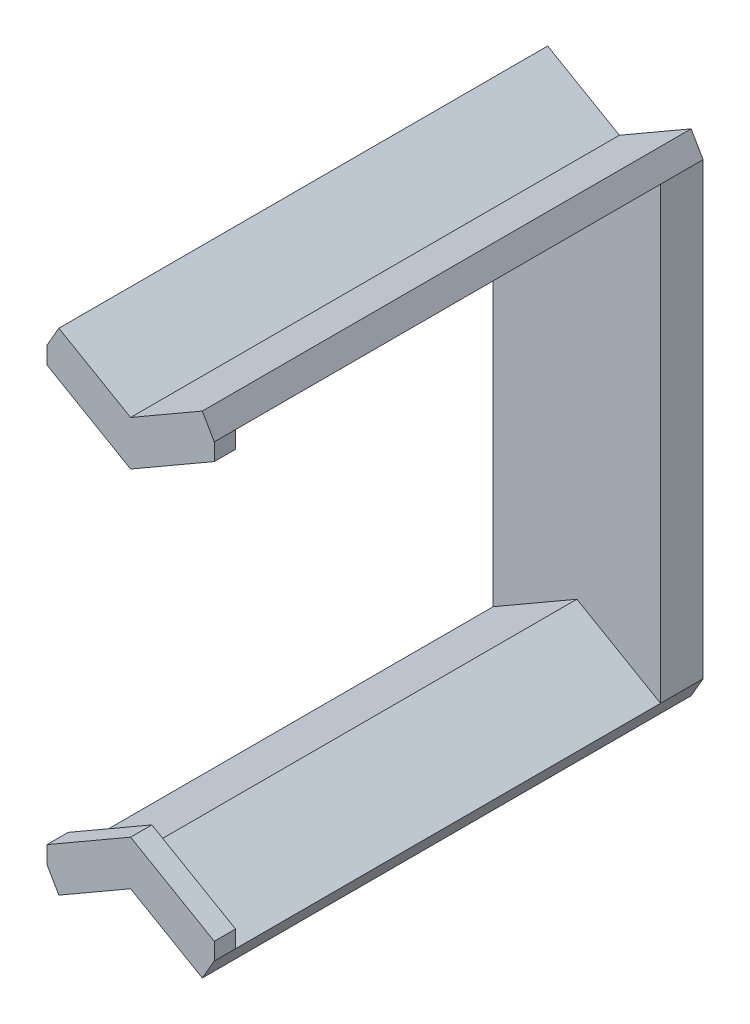
ISO-10303-21;
HEADER;
FILE_DESCRIPTION(('STEP AP214'),'2;1');
FILE_NAME('part.step','',(''),(''),'','','');
FILE_SCHEMA(('AUTOMOTIVE_DESIGN { 1 0 10303 214 1 1 1 1 }'));
ENDSEC;
DATA;
#1=APPLICATION_CONTEXT('core data for automotive mechanical design processes');
#2=APPLICATION_PROTOCOL_DEFINITION('international standard','automotive_design',2000,#1);
#3=PRODUCT_CONTEXT('',#1,'mechanical');
#4=PRODUCT('Part','Part','',(#3));
#5=PRODUCT_RELATED_PRODUCT_CATEGORY('part','',(#4));
#6=PRODUCT_DEFINITION_FORMATION('','',#4);
#7=PRODUCT_DEFINITION_CONTEXT('part definition',#1,'design');
#8=PRODUCT_DEFINITION('design','',#6,#7);
#9=PRODUCT_DEFINITION_SHAPE('','',#8);
#10=(LENGTH_UNIT() NAMED_UNIT(*) SI_UNIT(.MILLI.,.METRE.));
#11=(NAMED_UNIT(*) PLANE_ANGLE_UNIT() SI_UNIT($,.RADIAN.));
#12=(NAMED_UNIT(*) SI_UNIT($,.STERADIAN.) SOLID_ANGLE_UNIT());
#13=UNCERTAINTY_MEASURE_WITH_UNIT(LENGTH_MEASURE(1.E-05),#10,'distance_accuracy_value','');
#14=(GEOMETRIC_REPRESENTATION_CONTEXT(3) GLOBAL_UNCERTAINTY_ASSIGNED_CONTEXT((#13)) GLOBAL_UNIT_ASSIGNED_CONTEXT((#10,
#11,#12)) REPRESENTATION_CONTEXT('',''));
#15=CARTESIAN_POINT('',(0.,0.,0.));
#16=DIRECTION('',(0.,0.,1.));
#17=DIRECTION('',(1.,0.,0.));
#18=AXIS2_PLACEMENT_3D('',#15,#16,#17);
#19=CARTESIAN_POINT('',(0.,0.,1.));
#20=DIRECTION('',(0.,0.,1.));
#21=DIRECTION('',(1.,0.,0.));
#22=AXIS2_PLACEMENT_3D('',#19,#20,#21);
#23=PLANE('',#22);
#24=DIRECTION('',(-0.866025403784438,-0.500000000000001,0.));
#25=VECTOR('',#24,1.);
#26=CARTESIAN_POINT('',(-1.79783573777248,3.113942841485,1.));
#27=LINE('',#26,#25);
#28=CARTESIAN_POINT('',(1.96875000000001,5.28858213111376,1.));
#29=VERTEX_POINT('',#28);
#30=CARTESIAN_POINT('',(0.,4.15192378864667,1.));
#31=VERTEX_POINT('',#30);
#32=EDGE_CURVE('E297',#29,#31,#27,.T.);
#33=ORIENTED_EDGE('',*,*,#32,.T.);
#34=DIRECTION('',(-0.866025403784442,0.499999999999995,0.));
#35=VECTOR('',#34,1.);
#36=CARTESIAN_POINT('',(1.79783573777246,3.11394284148502,1.));
#37=LINE('',#36,#35);
#38=CARTESIAN_POINT('',(-1.96875000000001,5.28858213111374,1.));
#39=VERTEX_POINT('',#38);
#40=EDGE_CURVE('E301',#31,#39,#37,.T.);
#41=ORIENTED_EDGE('',*,*,#40,.T.);
#42=DIRECTION('',(0.,-1.,0.));
#43=VECTOR('',#42,1.);
#44=CARTESIAN_POINT('',(-1.96875000000001,0.,1.));
#45=LINE('',#44,#43);
#46=CARTESIAN_POINT('',(-1.96875000000002,-5.28858213111374,1.));
#47=VERTEX_POINT('',#46);
#48=EDGE_CURVE('E126',#39,#47,#45,.T.);
#49=ORIENTED_EDGE('',*,*,#48,.T.);
#50=DIRECTION('',(-0.86602540378445,-0.49999999999998,0.));
#51=VECTOR('',#50,1.);
#52=CARTESIAN_POINT('',(1.79783573777242,-3.11394284148507,1.));
#53=LINE('',#52,#51);
#54=CARTESIAN_POINT('',(0.,-4.15192378864664,1.));
#55=VERTEX_POINT('',#54);
#56=EDGE_CURVE('E122',#55,#47,#53,.T.);
#57=ORIENTED_EDGE('',*,*,#56,.F.);
#58=DIRECTION('',(-0.866025403784427,0.50000000000002,0.));
#59=VECTOR('',#58,1.);
#60=CARTESIAN_POINT('',(-1.7978357377725,-3.11394284148488,1.));
#61=LINE('',#60,#59);
#62=CARTESIAN_POINT('',(1.96875000000001,-5.28858213111376,1.));
#63=VERTEX_POINT('',#62);
#64=EDGE_CURVE('E57',#63,#55,#61,.T.);
#65=ORIENTED_EDGE('',*,*,#64,.F.);
#66=DIRECTION('',(0.,-1.,0.));
#67=VECTOR('',#66,1.);
#68=CARTESIAN_POINT('',(1.96875000000001,0.,1.));
#69=LINE('',#68,#67);
#70=EDGE_CURVE('E110',#29,#63,#69,.T.);
#71=ORIENTED_EDGE('',*,*,#70,.F.);
#72=EDGE_LOOP('',(#33,#41,#49,#57,#65,#71));
#73=FACE_BOUND('',#72,.T.);
#74=ADVANCED_FACE('F39',(#73),#23,.T.);
#75=CARTESIAN_POINT('',(-2.07908573777248,3.60108213111375,1.));
#76=DIRECTION('',(-0.500000000000001,0.866025403784438,0.));
#77=DIRECTION('',(-0.866025403784438,-0.500000000000001,0.));
#78=AXIS2_PLACEMENT_3D('',#75,#76,#77);
#79=PLANE('',#78);
#80=DIRECTION('',(0.866025403784438,0.500000000000001,0.));
#81=VECTOR('',#80,1.);
#82=CARTESIAN_POINT('',(-2.07908573777248,3.60108213111375,0.));
#83=LINE('',#82,#81);
#84=CARTESIAN_POINT('',(0.,4.801442841485,0.));
#85=VERTEX_POINT('',#84);
#86=CARTESIAN_POINT('',(1.68750000000001,5.77572142074251,0.));
#87=VERTEX_POINT('',#86);
#88=EDGE_CURVE('E102',#85,#87,#83,.T.);
#89=ORIENTED_EDGE('',*,*,#88,.F.);
#90=DIRECTION('',(0.,0.,-1.));
#91=VECTOR('',#90,1.);
#92=CARTESIAN_POINT('',(0.,4.801442841485,1.));
#93=LINE('',#92,#91);
#94=CARTESIAN_POINT('',(0.,4.801442841485,11.5));
#95=VERTEX_POINT('',#94);
#96=EDGE_CURVE('E11',#95,#85,#93,.T.);
#97=ORIENTED_EDGE('',*,*,#96,.F.);
#98=DIRECTION('',(0.866025403784438,0.500000000000001,0.));
#99=VECTOR('',#98,1.);
#100=CARTESIAN_POINT('',(-2.07908573777248,3.60108213111375,11.5));
#101=LINE('',#100,#99);
#102=CARTESIAN_POINT('',(1.68750000000001,5.77572142074251,11.5));
#103=VERTEX_POINT('',#102);
#104=EDGE_CURVE('E106',#95,#103,#101,.T.);
#105=ORIENTED_EDGE('',*,*,#104,.T.);
#106=DIRECTION('',(0.,0.,-1.));
#107=VECTOR('',#106,1.);
#108=CARTESIAN_POINT('',(1.68750000000001,5.77572142074251,1.));
#109=LINE('',#108,#107);
#110=EDGE_CURVE('E99',#103,#87,#109,.T.);
#111=ORIENTED_EDGE('',*,*,#110,.T.);
#112=EDGE_LOOP('',(#89,#97,#105,#111));
#113=FACE_BOUND('',#112,.T.);
#114=ADVANCED_FACE('F41',(#113),#79,.T.);
#115=CARTESIAN_POINT('',(2.07908573777246,3.60108213111378,1.));
#116=DIRECTION('',(0.499999999999995,0.866025403784442,0.));
#117=DIRECTION('',(-0.866025403784442,0.499999999999995,0.));
#118=AXIS2_PLACEMENT_3D('',#115,#116,#117);
#119=PLANE('',#118);
#120=DIRECTION('',(0.866025403784442,-0.499999999999995,0.));
#121=VECTOR('',#120,1.);
#122=CARTESIAN_POINT('',(2.07908573777246,3.60108213111378,0.));
#123=LINE('',#122,#121);
#124=CARTESIAN_POINT('',(-1.6875,5.77572142074248,0.));
#125=VERTEX_POINT('',#124);
#126=EDGE_CURVE('E120',#125,#85,#123,.T.);
#127=ORIENTED_EDGE('',*,*,#126,.F.);
#128=DIRECTION('',(0.,0.,-1.));
#129=VECTOR('',#128,1.);
#130=CARTESIAN_POINT('',(-1.6875,5.77572142074248,1.));
#131=LINE('',#130,#129);
#132=CARTESIAN_POINT('',(-1.6875,5.77572142074248,11.5));
#133=VERTEX_POINT('',#132);
#134=EDGE_CURVE('E49',#133,#125,#131,.T.);
#135=ORIENTED_EDGE('',*,*,#134,.F.);
#136=DIRECTION('',(0.866025403784442,-0.499999999999995,0.));
#137=VECTOR('',#136,1.);
#138=CARTESIAN_POINT('',(2.07908573777246,3.60108213111378,11.5));
#139=LINE('',#138,#137);
#140=EDGE_CURVE('E415',#133,#95,#139,.T.);
#141=ORIENTED_EDGE('',*,*,#140,.T.);
#142=ORIENTED_EDGE('',*,*,#96,.T.);
#143=EDGE_LOOP('',(#127,#135,#141,#142));
#144=FACE_BOUND('',#143,.T.);
#145=ADVANCED_FACE('F177',(#144),#119,.T.);
#146=CARTESIAN_POINT('',(-3.76658573777253,2.17463928962899,1.));
#147=DIRECTION('',(0.866025403784417,-0.500000000000038,0.));
#148=DIRECTION('',(0.500000000000037,0.866025403784417,0.));
#149=AXIS2_PLACEMENT_3D('',#146,#147,#148);
#150=PLANE('',#149);
#151=DIRECTION('',(-0.500000000000038,-0.866025403784417,0.));
#152=VECTOR('',#151,1.);
#153=CARTESIAN_POINT('',(-3.76658573777253,2.17463928962899,0.));
#154=LINE('',#153,#152);
#155=CARTESIAN_POINT('',(-1.96875000000001,5.28858213111374,0.));
#156=VERTEX_POINT('',#155);
#157=EDGE_CURVE('E165',#125,#156,#154,.T.);
#158=ORIENTED_EDGE('',*,*,#157,.T.);
#159=DIRECTION('',(0.,0.,-1.));
#160=VECTOR('',#159,1.);
#161=CARTESIAN_POINT('',(-1.96875000000001,5.28858213111374,1.));
#162=LINE('',#161,#160);
#163=EDGE_CURVE('E156',#39,#156,#162,.T.);
#164=ORIENTED_EDGE('',*,*,#163,.F.);
#165=DIRECTION('',(0.,0.,-1.));
#166=VECTOR('',#165,1.);
#167=CARTESIAN_POINT('',(-1.96875000000001,5.28858213111374,11.));
#168=LINE('',#167,#166);
#169=CARTESIAN_POINT('',(-1.96875000000001,5.28858213111374,11.));
#170=VERTEX_POINT('',#169);
#171=EDGE_CURVE('E293',#170,#39,#168,.T.);
#172=ORIENTED_EDGE('',*,*,#171,.F.);
#173=DIRECTION('',(0.,0.,-1.));
#174=VECTOR('',#173,1.);
#175=CARTESIAN_POINT('',(-1.96875000000001,5.28858213111374,11.5));
#176=LINE('',#175,#174);
#177=CARTESIAN_POINT('',(-1.96875000000001,5.28858213111374,11.5));
#178=VERTEX_POINT('',#177);
#179=EDGE_CURVE('E246',#178,#170,#176,.T.);
#180=ORIENTED_EDGE('',*,*,#179,.F.);
#181=DIRECTION('',(-0.500000000000038,-0.866025403784417,0.));
#182=VECTOR('',#181,1.);
#183=CARTESIAN_POINT('',(-3.76658573777253,2.17463928962899,11.5));
#184=LINE('',#183,#182);
#185=EDGE_CURVE('E169',#133,#178,#184,.T.);
#186=ORIENTED_EDGE('',*,*,#185,.F.);
#187=ORIENTED_EDGE('',*,*,#134,.T.);
#188=EDGE_LOOP('',(#158,#164,#172,#180,#186,#187));
#189=FACE_BOUND('',#188,.T.);
#190=ADVANCED_FACE('F163',(#189),#150,.F.);
#191=CARTESIAN_POINT('',(-1.96875000000001,0.,1.));
#192=DIRECTION('',(1.,0.,0.));
#193=DIRECTION('',(0.,0.,-1.));
#194=AXIS2_PLACEMENT_3D('',#191,#192,#193);
#195=PLANE('',#194);
#196=DIRECTION('',(0.,-1.,0.));
#197=VECTOR('',#196,1.);
#198=CARTESIAN_POINT('',(-1.96875000000001,0.,0.));
#199=LINE('',#198,#197);
#200=CARTESIAN_POINT('',(-1.96875000000002,-5.28858213111374,0.));
#201=VERTEX_POINT('',#200);
#202=EDGE_CURVE('E174',#156,#201,#199,.T.);
#203=ORIENTED_EDGE('',*,*,#202,.T.);
#204=DIRECTION('',(0.,0.,-1.));
#205=VECTOR('',#204,1.);
#206=CARTESIAN_POINT('',(-1.96875000000002,-5.28858213111374,1.));
#207=LINE('',#206,#205);
#208=EDGE_CURVE('E152',#47,#201,#207,.T.);
#209=ORIENTED_EDGE('',*,*,#208,.F.);
#210=ORIENTED_EDGE('',*,*,#48,.F.);
#211=ORIENTED_EDGE('',*,*,#163,.T.);
#212=EDGE_LOOP('',(#203,#209,#210,#211));
#213=FACE_BOUND('',#212,.T.);
#214=ADVANCED_FACE('F492',(#213),#195,.F.);
#215=CARTESIAN_POINT('',(-3.76658573777253,-2.17463928962899,1.));
#216=DIRECTION('',(0.866025403784418,0.500000000000037,0.));
#217=DIRECTION('',(-0.500000000000037,0.866025403784418,0.));
#218=AXIS2_PLACEMENT_3D('',#215,#216,#217);
#219=PLANE('',#218);
#220=DIRECTION('',(0.500000000000037,-0.866025403784418,0.));
#221=VECTOR('',#220,1.);
#222=CARTESIAN_POINT('',(-3.76658573777253,-2.17463928962899,0.));
#223=LINE('',#222,#221);
#224=CARTESIAN_POINT('',(-1.6875,-5.77572142074248,0.));
#225=VERTEX_POINT('',#224);
#226=EDGE_CURVE('E184',#201,#225,#223,.T.);
#227=ORIENTED_EDGE('',*,*,#226,.T.);
#228=DIRECTION('',(0.,0.,-1.));
#229=VECTOR('',#228,1.);
#230=CARTESIAN_POINT('',(-1.6875,-5.77572142074248,1.));
#231=LINE('',#230,#229);
#232=CARTESIAN_POINT('',(-1.6875,-5.77572142074248,11.5));
#233=VERTEX_POINT('',#232);
#234=EDGE_CURVE('E148',#233,#225,#231,.T.);
#235=ORIENTED_EDGE('',*,*,#234,.F.);
#236=DIRECTION('',(0.500000000000037,-0.866025403784418,0.));
#237=VECTOR('',#236,1.);
#238=CARTESIAN_POINT('',(-3.76658573777253,-2.17463928962899,11.5));
#239=LINE('',#238,#237);
#240=CARTESIAN_POINT('',(-1.96875000000005,-5.28858213111369,11.5));
#241=VERTEX_POINT('',#240);
#242=EDGE_CURVE('E228',#241,#233,#239,.T.);
#243=ORIENTED_EDGE('',*,*,#242,.F.);
#244=DIRECTION('',(0.,0.,-1.));
#245=VECTOR('',#244,1.);
#246=CARTESIAN_POINT('',(-1.96875000000005,-5.28858213111369,11.5));
#247=LINE('',#246,#245);
#248=CARTESIAN_POINT('',(-1.96875000000005,-5.28858213111369,11.));
#249=VERTEX_POINT('',#248);
#250=EDGE_CURVE('E262',#241,#249,#247,.T.);
#251=ORIENTED_EDGE('',*,*,#250,.T.);
#252=DIRECTION('',(0.,0.,-1.));
#253=VECTOR('',#252,1.);
#254=CARTESIAN_POINT('',(-1.96875000000005,-5.28858213111369,11.));
#255=LINE('',#254,#253);
#256=EDGE_CURVE('E321',#249,#47,#255,.T.);
#257=ORIENTED_EDGE('',*,*,#256,.T.);
#258=ORIENTED_EDGE('',*,*,#208,.T.);
#259=EDGE_LOOP('',(#227,#235,#243,#251,#257,#258));
#260=FACE_BOUND('',#259,.T.);
#261=ADVANCED_FACE('F488',(#260),#219,.F.);
#262=CARTESIAN_POINT('',(2.07908573777246,-3.60108213111378,1.));
#263=DIRECTION('',(-0.499999999999995,0.866025403784442,0.));
#264=DIRECTION('',(-0.866025403784442,-0.499999999999995,0.));
#265=AXIS2_PLACEMENT_3D('',#262,#263,#264);
#266=PLANE('',#265);
#267=DIRECTION('',(0.866025403784442,0.499999999999995,0.));
#268=VECTOR('',#267,1.);
#269=CARTESIAN_POINT('',(2.07908573777246,-3.60108213111378,0.));
#270=LINE('',#269,#268);
#271=CARTESIAN_POINT('',(0.,-4.801442841485,0.));
#272=VERTEX_POINT('',#271);
#273=EDGE_CURVE('E187',#225,#272,#270,.T.);
#274=ORIENTED_EDGE('',*,*,#273,.T.);
#275=DIRECTION('',(0.,0.,-1.));
#276=VECTOR('',#275,1.);
#277=CARTESIAN_POINT('',(0.,-4.801442841485,1.));
#278=LINE('',#277,#276);
#279=CARTESIAN_POINT('',(0.,-4.801442841485,11.5));
#280=VERTEX_POINT('',#279);
#281=EDGE_CURVE('E144',#280,#272,#278,.T.);
#282=ORIENTED_EDGE('',*,*,#281,.F.);
#283=DIRECTION('',(0.866025403784442,0.499999999999995,0.));
#284=VECTOR('',#283,1.);
#285=CARTESIAN_POINT('',(2.07908573777246,-3.60108213111378,11.5));
#286=LINE('',#285,#284);
#287=EDGE_CURVE('E220',#233,#280,#286,.T.);
#288=ORIENTED_EDGE('',*,*,#287,.F.);
#289=ORIENTED_EDGE('',*,*,#234,.T.);
#290=EDGE_LOOP('',(#274,#282,#288,#289));
#291=FACE_BOUND('',#290,.T.);
#292=ADVANCED_FACE('F218',(#291),#266,.F.);
#293=CARTESIAN_POINT('',(-2.07908573777248,-3.60108213111375,1.));
#294=DIRECTION('',(0.500000000000001,0.866025403784438,0.));
#295=DIRECTION('',(-0.866025403784438,0.500000000000001,0.));
#296=AXIS2_PLACEMENT_3D('',#293,#294,#295);
#297=PLANE('',#296);
#298=DIRECTION('',(0.866025403784438,-0.500000000000001,0.));
#299=VECTOR('',#298,1.);
#300=CARTESIAN_POINT('',(-2.07908573777248,-3.60108213111375,0.));
#301=LINE('',#300,#299);
#302=CARTESIAN_POINT('',(1.68750000000001,-5.77572142074251,0.));
#303=VERTEX_POINT('',#302);
#304=EDGE_CURVE('E190',#272,#303,#301,.T.);
#305=ORIENTED_EDGE('',*,*,#304,.T.);
#306=DIRECTION('',(0.,0.,-1.));
#307=VECTOR('',#306,1.);
#308=CARTESIAN_POINT('',(1.68750000000001,-5.77572142074251,1.));
#309=LINE('',#308,#307);
#310=CARTESIAN_POINT('',(1.68750000000001,-5.77572142074251,11.5));
#311=VERTEX_POINT('',#310);
#312=EDGE_CURVE('E141',#311,#303,#309,.T.);
#313=ORIENTED_EDGE('',*,*,#312,.F.);
#314=DIRECTION('',(0.866025403784438,-0.500000000000001,0.));
#315=VECTOR('',#314,1.);
#316=CARTESIAN_POINT('',(-2.07908573777248,-3.60108213111375,11.5));
#317=LINE('',#316,#315);
#318=EDGE_CURVE('E214',#280,#311,#317,.T.);
#319=ORIENTED_EDGE('',*,*,#318,.F.);
#320=ORIENTED_EDGE('',*,*,#281,.T.);
#321=EDGE_LOOP('',(#305,#313,#319,#320));
#322=FACE_BOUND('',#321,.T.);
#323=ADVANCED_FACE('F211',(#322),#297,.F.);
#324=CARTESIAN_POINT('',(3.76658573777249,-2.17463928962875,1.));
#325=DIRECTION('',(0.866025403784438,-0.500000000000001,0.));
#326=DIRECTION('',(0.500000000000001,0.866025403784438,0.));
#327=AXIS2_PLACEMENT_3D('',#324,#325,#326);
#328=PLANE('',#327);
#329=DIRECTION('',(-0.500000000000001,-0.866025403784438,0.));
#330=VECTOR('',#329,1.);
#331=CARTESIAN_POINT('',(3.76658573777249,-2.17463928962875,0.));
#332=LINE('',#331,#330);
#333=CARTESIAN_POINT('',(1.96875000000001,-5.28858213111376,0.));
#334=VERTEX_POINT('',#333);
#335=EDGE_CURVE('E132',#334,#303,#332,.T.);
#336=ORIENTED_EDGE('',*,*,#335,.F.);
#337=DIRECTION('',(0.,0.,-1.));
#338=VECTOR('',#337,1.);
#339=CARTESIAN_POINT('',(1.96875000000001,-5.28858213111376,1.));
#340=LINE('',#339,#338);
#341=EDGE_CURVE('E138',#63,#334,#340,.T.);
#342=ORIENTED_EDGE('',*,*,#341,.F.);
#343=DIRECTION('',(0.,0.,-1.));
#344=VECTOR('',#343,1.);
#345=CARTESIAN_POINT('',(1.96875000000001,-5.28858213111376,11.));
#346=LINE('',#345,#344);
#347=CARTESIAN_POINT('',(1.96875000000001,-5.28858213111376,11.));
#348=VERTEX_POINT('',#347);
#349=EDGE_CURVE('E317',#348,#63,#346,.T.);
#350=ORIENTED_EDGE('',*,*,#349,.F.);
#351=DIRECTION('',(0.,0.,-1.));
#352=VECTOR('',#351,1.);
#353=CARTESIAN_POINT('',(1.96875000000001,-5.28858213111376,11.5));
#354=LINE('',#353,#352);
#355=CARTESIAN_POINT('',(1.96875000000001,-5.28858213111376,11.5));
#356=VERTEX_POINT('',#355);
#357=EDGE_CURVE('E240',#356,#348,#354,.T.);
#358=ORIENTED_EDGE('',*,*,#357,.F.);
#359=DIRECTION('',(-0.500000000000001,-0.866025403784438,0.));
#360=VECTOR('',#359,1.);
#361=CARTESIAN_POINT('',(3.76658573777249,-2.17463928962875,11.5));
#362=LINE('',#361,#360);
#363=EDGE_CURVE('E207',#356,#311,#362,.T.);
#364=ORIENTED_EDGE('',*,*,#363,.T.);
#365=ORIENTED_EDGE('',*,*,#312,.T.);
#366=EDGE_LOOP('',(#336,#342,#350,#358,#364,#365));
#367=FACE_BOUND('',#366,.T.);
#368=ADVANCED_FACE('F199',(#367),#328,.T.);
#369=CARTESIAN_POINT('',(1.96875000000001,0.,1.));
#370=DIRECTION('',(1.,0.,0.));
#371=DIRECTION('',(0.,0.,-1.));
#372=AXIS2_PLACEMENT_3D('',#369,#370,#371);
#373=PLANE('',#372);
#374=DIRECTION('',(0.,-1.,0.));
#375=VECTOR('',#374,1.);
#376=CARTESIAN_POINT('',(1.96875000000001,0.,0.));
#377=LINE('',#376,#375);
#378=CARTESIAN_POINT('',(1.96875000000001,5.28858213111376,0.));
#379=VERTEX_POINT('',#378);
#380=EDGE_CURVE('E127',#379,#334,#377,.T.);
#381=ORIENTED_EDGE('',*,*,#380,.F.);
#382=DIRECTION('',(0.,0.,-1.));
#383=VECTOR('',#382,1.);
#384=CARTESIAN_POINT('',(1.96875000000001,5.28858213111376,1.));
#385=LINE('',#384,#383);
#386=EDGE_CURVE('E92',#29,#379,#385,.T.);
#387=ORIENTED_EDGE('',*,*,#386,.F.);
#388=ORIENTED_EDGE('',*,*,#70,.T.);
#389=ORIENTED_EDGE('',*,*,#341,.T.);
#390=EDGE_LOOP('',(#381,#387,#388,#389));
#391=FACE_BOUND('',#390,.T.);
#392=ADVANCED_FACE('F331',(#391),#373,.T.);
#393=CARTESIAN_POINT('',(3.76658573777249,2.17463928962876,1.));
#394=DIRECTION('',(0.866025403784438,0.500000000000001,0.));
#395=DIRECTION('',(-0.500000000000001,0.866025403784438,0.));
#396=AXIS2_PLACEMENT_3D('',#393,#394,#395);
#397=PLANE('',#396);
#398=DIRECTION('',(0.500000000000001,-0.866025403784438,0.));
#399=VECTOR('',#398,1.);
#400=CARTESIAN_POINT('',(3.76658573777249,2.17463928962876,0.));
#401=LINE('',#400,#399);
#402=EDGE_CURVE('E117',#87,#379,#401,.T.);
#403=ORIENTED_EDGE('',*,*,#402,.F.);
#404=ORIENTED_EDGE('',*,*,#110,.F.);
#405=DIRECTION('',(0.500000000000001,-0.866025403784438,0.));
#406=VECTOR('',#405,1.);
#407=CARTESIAN_POINT('',(3.76658573777249,2.17463928962876,11.5));
#408=LINE('',#407,#406);
#409=CARTESIAN_POINT('',(1.96875000000001,5.28858213111376,11.5));
#410=VERTEX_POINT('',#409);
#411=EDGE_CURVE('E417',#103,#410,#408,.T.);
#412=ORIENTED_EDGE('',*,*,#411,.T.);
#413=DIRECTION('',(0.,0.,-1.));
#414=VECTOR('',#413,1.);
#415=CARTESIAN_POINT('',(1.96875000000001,5.28858213111376,11.5));
#416=LINE('',#415,#414);
#417=CARTESIAN_POINT('',(1.96875000000001,5.28858213111376,11.));
#418=VERTEX_POINT('',#417);
#419=EDGE_CURVE('E439',#410,#418,#416,.T.);
#420=ORIENTED_EDGE('',*,*,#419,.T.);
#421=DIRECTION('',(0.,0.,-1.));
#422=VECTOR('',#421,1.);
#423=CARTESIAN_POINT('',(1.96875000000001,5.28858213111376,11.));
#424=LINE('',#423,#422);
#425=EDGE_CURVE('E286',#418,#29,#424,.T.);
#426=ORIENTED_EDGE('',*,*,#425,.T.);
#427=ORIENTED_EDGE('',*,*,#386,.T.);
#428=EDGE_LOOP('',(#403,#404,#412,#420,#426,#427));
#429=FACE_BOUND('',#428,.T.);
#430=ADVANCED_FACE('F124',(#429),#397,.T.);
#431=CARTESIAN_POINT('',(0.,0.,0.));
#432=DIRECTION('',(0.,0.,1.));
#433=DIRECTION('',(1.,0.,0.));
#434=AXIS2_PLACEMENT_3D('',#431,#432,#433);
#435=PLANE('',#434);
#436=ORIENTED_EDGE('',*,*,#202,.F.);
#437=ORIENTED_EDGE('',*,*,#157,.F.);
#438=ORIENTED_EDGE('',*,*,#126,.T.);
#439=ORIENTED_EDGE('',*,*,#88,.T.);
#440=ORIENTED_EDGE('',*,*,#402,.T.);
#441=ORIENTED_EDGE('',*,*,#380,.T.);
#442=ORIENTED_EDGE('',*,*,#335,.T.);
#443=ORIENTED_EDGE('',*,*,#304,.F.);
#444=ORIENTED_EDGE('',*,*,#273,.F.);
#445=ORIENTED_EDGE('',*,*,#226,.F.);
#446=EDGE_LOOP('',(#436,#437,#438,#439,#440,#441,#442,#443,#444,#445));
#447=FACE_BOUND('',#446,.T.);
#448=ADVANCED_FACE('F115',(#447),#435,.F.);
#449=CARTESIAN_POINT('',(1.79783573777242,-3.11394284148507,11.));
#450=DIRECTION('',(-0.49999999999998,0.86602540378445,0.));
#451=DIRECTION('',(-0.86602540378445,-0.49999999999998,0.));
#452=AXIS2_PLACEMENT_3D('',#449,#450,#451);
#453=PLANE('',#452);
#454=DIRECTION('',(0.,0.,-1.));
#455=VECTOR('',#454,1.);
#456=CARTESIAN_POINT('',(0.,-4.15192378864664,11.));
#457=LINE('',#456,#455);
#458=CARTESIAN_POINT('',(0.,-4.15192378864664,11.));
#459=VERTEX_POINT('',#458);
#460=EDGE_CURVE('E313',#459,#55,#457,.T.);
#461=ORIENTED_EDGE('',*,*,#460,.T.);
#462=ORIENTED_EDGE('',*,*,#56,.T.);
#463=ORIENTED_EDGE('',*,*,#256,.F.);
#464=DIRECTION('',(0.86602540378445,0.49999999999998,0.));
#465=VECTOR('',#464,1.);
#466=CARTESIAN_POINT('',(1.79783573777242,-3.11394284148507,11.));
#467=LINE('',#466,#465);
#468=EDGE_CURVE('E305',#249,#459,#467,.T.);
#469=ORIENTED_EDGE('',*,*,#468,.T.);
#470=EDGE_LOOP('',(#461,#462,#463,#469));
#471=FACE_BOUND('',#470,.T.);
#472=ADVANCED_FACE('F494',(#471),#453,.T.);
#473=CARTESIAN_POINT('',(-1.7978357377725,-3.11394284148488,11.));
#474=DIRECTION('',(0.50000000000002,0.866025403784427,0.));
#475=DIRECTION('',(-0.866025403784427,0.50000000000002,0.));
#476=AXIS2_PLACEMENT_3D('',#473,#474,#475);
#477=PLANE('',#476);
#478=ORIENTED_EDGE('',*,*,#349,.T.);
#479=ORIENTED_EDGE('',*,*,#64,.T.);
#480=ORIENTED_EDGE('',*,*,#460,.F.);
#481=DIRECTION('',(0.866025403784427,-0.50000000000002,0.));
#482=VECTOR('',#481,1.);
#483=CARTESIAN_POINT('',(-1.7978357377725,-3.11394284148488,11.));
#484=LINE('',#483,#482);
#485=EDGE_CURVE('E309',#459,#348,#484,.T.);
#486=ORIENTED_EDGE('',*,*,#485,.T.);
#487=EDGE_LOOP('',(#478,#479,#480,#486));
#488=FACE_BOUND('',#487,.T.);
#489=ADVANCED_FACE('F334',(#488),#477,.T.);
#490=CARTESIAN_POINT('',(1.79783573777246,3.11394284148502,11.));
#491=DIRECTION('',(0.499999999999995,0.866025403784442,0.));
#492=DIRECTION('',(-0.866025403784442,0.499999999999995,0.));
#493=AXIS2_PLACEMENT_3D('',#490,#491,#492);
#494=PLANE('',#493);
#495=ORIENTED_EDGE('',*,*,#40,.F.);
#496=DIRECTION('',(0.,0.,-1.));
#497=VECTOR('',#496,1.);
#498=CARTESIAN_POINT('',(0.,4.15192378864667,11.));
#499=LINE('',#498,#497);
#500=CARTESIAN_POINT('',(0.,4.15192378864667,11.));
#501=VERTEX_POINT('',#500);
#502=EDGE_CURVE('E289',#501,#31,#499,.T.);
#503=ORIENTED_EDGE('',*,*,#502,.F.);
#504=DIRECTION('',(0.866025403784442,-0.499999999999995,0.));
#505=VECTOR('',#504,1.);
#506=CARTESIAN_POINT('',(1.79783573777246,3.11394284148502,11.));
#507=LINE('',#506,#505);
#508=EDGE_CURVE('E278',#170,#501,#507,.T.);
#509=ORIENTED_EDGE('',*,*,#508,.F.);
#510=ORIENTED_EDGE('',*,*,#171,.T.);
#511=EDGE_LOOP('',(#495,#503,#509,#510));
#512=FACE_BOUND('',#511,.T.);
#513=ADVANCED_FACE('F498',(#512),#494,.F.);
#514=CARTESIAN_POINT('',(-1.79783573777248,3.113942841485,11.));
#515=DIRECTION('',(-0.500000000000001,0.866025403784438,0.));
#516=DIRECTION('',(-0.866025403784438,-0.500000000000001,0.));
#517=AXIS2_PLACEMENT_3D('',#514,#515,#516);
#518=PLANE('',#517);
#519=ORIENTED_EDGE('',*,*,#32,.F.);
#520=ORIENTED_EDGE('',*,*,#425,.F.);
#521=DIRECTION('',(0.866025403784438,0.500000000000001,0.));
#522=VECTOR('',#521,1.);
#523=CARTESIAN_POINT('',(-1.79783573777248,3.113942841485,11.));
#524=LINE('',#523,#522);
#525=EDGE_CURVE('E282',#501,#418,#524,.T.);
#526=ORIENTED_EDGE('',*,*,#525,.F.);
#527=ORIENTED_EDGE('',*,*,#502,.T.);
#528=EDGE_LOOP('',(#519,#520,#526,#527));
#529=FACE_BOUND('',#528,.T.);
#530=ADVANCED_FACE('F521',(#529),#518,.F.);
#531=CARTESIAN_POINT('',(1.96875000000001,0.,11.5));
#532=DIRECTION('',(1.,0.,0.));
#533=DIRECTION('',(0.,0.,-1.));
#534=AXIS2_PLACEMENT_3D('',#531,#532,#533);
#535=PLANE('',#534);
#536=DIRECTION('',(0.,-1.,0.));
#537=VECTOR('',#536,1.);
#538=CARTESIAN_POINT('',(1.96875000000001,0.,11.));
#539=LINE('',#538,#537);
#540=CARTESIAN_POINT('',(1.96875000000001,-4.88665834246707,11.));
#541=VERTEX_POINT('',#540);
#542=EDGE_CURVE('E241',#541,#348,#539,.T.);
#543=ORIENTED_EDGE('',*,*,#542,.F.);
#544=DIRECTION('',(0.,0.,-1.));
#545=VECTOR('',#544,1.);
#546=CARTESIAN_POINT('',(1.96875000000001,-4.88665834246707,11.5));
#547=LINE('',#546,#545);
#548=CARTESIAN_POINT('',(1.96875000000001,-4.88665834246707,11.5));
#549=VERTEX_POINT('',#548);
#550=EDGE_CURVE('E274',#549,#541,#547,.T.);
#551=ORIENTED_EDGE('',*,*,#550,.F.);
#552=DIRECTION('',(0.,-1.,0.));
#553=VECTOR('',#552,1.);
#554=CARTESIAN_POINT('',(1.96875000000001,0.,11.5));
#555=LINE('',#554,#553);
#556=EDGE_CURVE('E258',#549,#356,#555,.T.);
#557=ORIENTED_EDGE('',*,*,#556,.T.);
#558=ORIENTED_EDGE('',*,*,#357,.T.);
#559=EDGE_LOOP('',(#543,#551,#557,#558));
#560=FACE_BOUND('',#559,.T.);
#561=ADVANCED_FACE('F523',(#560),#535,.T.);
#562=CARTESIAN_POINT('',(-1.62379763209581,-2.81250000000002,11.5));
#563=DIRECTION('',(-0.499999999999995,-0.866025403784441,0.));
#564=DIRECTION('',(0.866025403784442,-0.499999999999995,0.));
#565=AXIS2_PLACEMENT_3D('',#562,#563,#564);
#566=PLANE('',#565);
#567=DIRECTION('',(-0.866025403784442,0.499999999999995,0.));
#568=VECTOR('',#567,1.);
#569=CARTESIAN_POINT('',(-1.62379763209581,-2.81250000000002,11.));
#570=LINE('',#569,#568);
#571=CARTESIAN_POINT('',(0.,-3.75,11.));
#572=VERTEX_POINT('',#571);
#573=EDGE_CURVE('E245',#541,#572,#570,.T.);
#574=ORIENTED_EDGE('',*,*,#573,.T.);
#575=DIRECTION('',(0.,0.,-1.));
#576=VECTOR('',#575,1.);
#577=CARTESIAN_POINT('',(0.,-3.75,11.5));
#578=LINE('',#577,#576);
#579=CARTESIAN_POINT('',(0.,-3.75,11.5));
#580=VERTEX_POINT('',#579);
#581=EDGE_CURVE('E270',#580,#572,#578,.T.);
#582=ORIENTED_EDGE('',*,*,#581,.F.);
#583=DIRECTION('',(-0.866025403784442,0.499999999999995,0.));
#584=VECTOR('',#583,1.);
#585=CARTESIAN_POINT('',(-1.62379763209581,-2.81250000000002,11.5));
#586=LINE('',#585,#584);
#587=EDGE_CURVE('E473',#549,#580,#586,.T.);
#588=ORIENTED_EDGE('',*,*,#587,.F.);
#589=ORIENTED_EDGE('',*,*,#550,.T.);
#590=EDGE_LOOP('',(#574,#582,#588,#589));
#591=FACE_BOUND('',#590,.T.);
#592=ADVANCED_FACE('F529',(#591),#566,.F.);
#593=CARTESIAN_POINT('',(1.62379763209582,-2.8125,11.5));
#594=DIRECTION('',(0.500000000000001,-0.866025403784438,0.));
#595=DIRECTION('',(0.866025403784438,0.500000000000001,0.));
#596=AXIS2_PLACEMENT_3D('',#593,#594,#595);
#597=PLANE('',#596);
#598=DIRECTION('',(-0.866025403784438,-0.500000000000001,0.));
#599=VECTOR('',#598,1.);
#600=CARTESIAN_POINT('',(1.62379763209582,-2.8125,11.));
#601=LINE('',#600,#599);
#602=CARTESIAN_POINT('',(-1.96875000000001,-4.88665834246709,11.));
#603=VERTEX_POINT('',#602);
#604=EDGE_CURVE('E250',#572,#603,#601,.T.);
#605=ORIENTED_EDGE('',*,*,#604,.T.);
#606=DIRECTION('',(0.,0.,-1.));
#607=VECTOR('',#606,1.);
#608=CARTESIAN_POINT('',(-1.96875000000001,-4.88665834246709,11.5));
#609=LINE('',#608,#607);
#610=CARTESIAN_POINT('',(-1.96875000000001,-4.88665834246709,11.5));
#611=VERTEX_POINT('',#610);
#612=EDGE_CURVE('E266',#611,#603,#609,.T.);
#613=ORIENTED_EDGE('',*,*,#612,.F.);
#614=DIRECTION('',(-0.866025403784438,-0.500000000000001,0.));
#615=VECTOR('',#614,1.);
#616=CARTESIAN_POINT('',(1.62379763209582,-2.8125,11.5));
#617=LINE('',#616,#615);
#618=EDGE_CURVE('E476',#580,#611,#617,.T.);
#619=ORIENTED_EDGE('',*,*,#618,.F.);
#620=ORIENTED_EDGE('',*,*,#581,.T.);
#621=EDGE_LOOP('',(#605,#613,#619,#620));
#622=FACE_BOUND('',#621,.T.);
#623=ADVANCED_FACE('F633',(#622),#597,.F.);
#624=CARTESIAN_POINT('',(-1.96875000000001,0.,11.5));
#625=DIRECTION('',(1.,0.,0.));
#626=DIRECTION('',(0.,0.,-1.));
#627=AXIS2_PLACEMENT_3D('',#624,#625,#626);
#628=PLANE('',#627);
#629=DIRECTION('',(0.,-1.,0.));
#630=VECTOR('',#629,1.);
#631=CARTESIAN_POINT('',(-1.96875000000001,0.,11.));
#632=LINE('',#631,#630);
#633=EDGE_CURVE('E254',#603,#249,#632,.T.);
#634=ORIENTED_EDGE('',*,*,#633,.T.);
#635=ORIENTED_EDGE('',*,*,#250,.F.);
#636=DIRECTION('',(0.,-1.,0.));
#637=VECTOR('',#636,1.);
#638=CARTESIAN_POINT('',(-1.96875000000001,0.,11.5));
#639=LINE('',#638,#637);
#640=EDGE_CURVE('E234',#611,#241,#639,.T.);
#641=ORIENTED_EDGE('',*,*,#640,.F.);
#642=ORIENTED_EDGE('',*,*,#612,.T.);
#643=EDGE_LOOP('',(#634,#635,#641,#642));
#644=FACE_BOUND('',#643,.T.);
#645=ADVANCED_FACE('F484',(#644),#628,.F.);
#646=CARTESIAN_POINT('',(0.,0.,11.5));
#647=DIRECTION('',(0.,0.,1.));
#648=DIRECTION('',(1.,0.,0.));
#649=AXIS2_PLACEMENT_3D('',#646,#647,#648);
#650=PLANE('',#649);
#651=ORIENTED_EDGE('',*,*,#556,.F.);
#652=ORIENTED_EDGE('',*,*,#587,.T.);
#653=ORIENTED_EDGE('',*,*,#618,.T.);
#654=ORIENTED_EDGE('',*,*,#640,.T.);
#655=ORIENTED_EDGE('',*,*,#242,.T.);
#656=ORIENTED_EDGE('',*,*,#287,.T.);
#657=ORIENTED_EDGE('',*,*,#318,.T.);
#658=ORIENTED_EDGE('',*,*,#363,.F.);
#659=EDGE_LOOP('',(#651,#652,#653,#654,#655,#656,#657,#658));
#660=FACE_BOUND('',#659,.T.);
#661=ADVANCED_FACE('F225',(#660),#650,.T.);
#662=CARTESIAN_POINT('',(0.,0.,11.));
#663=DIRECTION('',(0.,0.,1.));
#664=DIRECTION('',(1.,0.,0.));
#665=AXIS2_PLACEMENT_3D('',#662,#663,#664);
#666=PLANE('',#665);
#667=ORIENTED_EDGE('',*,*,#468,.F.);
#668=ORIENTED_EDGE('',*,*,#633,.F.);
#669=ORIENTED_EDGE('',*,*,#604,.F.);
#670=ORIENTED_EDGE('',*,*,#573,.F.);
#671=ORIENTED_EDGE('',*,*,#542,.T.);
#672=ORIENTED_EDGE('',*,*,#485,.F.);
#673=EDGE_LOOP('',(#667,#668,#669,#670,#671,#672));
#674=FACE_BOUND('',#673,.T.);
#675=ADVANCED_FACE('F661',(#674),#666,.F.);
#676=CARTESIAN_POINT('',(0.,0.,11.));
#677=DIRECTION('',(0.,0.,1.));
#678=DIRECTION('',(1.,0.,0.));
#679=AXIS2_PLACEMENT_3D('',#676,#677,#678);
#680=PLANE('',#679);
#681=DIRECTION('',(0.,-1.,0.));
#682=VECTOR('',#681,1.);
#683=CARTESIAN_POINT('',(-1.96875000000001,0.,11.));
#684=LINE('',#683,#682);
#685=CARTESIAN_POINT('',(-1.96875000000001,4.88665834246707,11.));
#686=VERTEX_POINT('',#685);
#687=EDGE_CURVE('E440',#170,#686,#684,.T.);
#688=ORIENTED_EDGE('',*,*,#687,.F.);
#689=ORIENTED_EDGE('',*,*,#508,.T.);
#690=ORIENTED_EDGE('',*,*,#525,.T.);
#691=DIRECTION('',(0.,-1.,0.));
#692=VECTOR('',#691,1.);
#693=CARTESIAN_POINT('',(1.96875000000001,0.,11.));
#694=LINE('',#693,#692);
#695=CARTESIAN_POINT('',(1.96875000000001,4.88665834246709,11.));
#696=VERTEX_POINT('',#695);
#697=EDGE_CURVE('E450',#418,#696,#694,.T.);
#698=ORIENTED_EDGE('',*,*,#697,.T.);
#699=DIRECTION('',(0.866025403784438,0.500000000000001,0.));
#700=VECTOR('',#699,1.);
#701=CARTESIAN_POINT('',(-1.62379763209582,2.8125,11.));
#702=LINE('',#701,#700);
#703=CARTESIAN_POINT('',(0.,3.75,11.));
#704=VERTEX_POINT('',#703);
#705=EDGE_CURVE('E446',#704,#696,#702,.T.);
#706=ORIENTED_EDGE('',*,*,#705,.F.);
#707=DIRECTION('',(0.866025403784442,-0.499999999999995,0.));
#708=VECTOR('',#707,1.);
#709=CARTESIAN_POINT('',(1.62379763209581,2.81250000000002,11.));
#710=LINE('',#709,#708);
#711=EDGE_CURVE('E443',#686,#704,#710,.T.);
#712=ORIENTED_EDGE('',*,*,#711,.F.);
#713=EDGE_LOOP('',(#688,#689,#690,#698,#706,#712));
#714=FACE_BOUND('',#713,.T.);
#715=ADVANCED_FACE('F506',(#714),#680,.F.);
#716=CARTESIAN_POINT('',(-1.96875000000001,0.,11.5));
#717=DIRECTION('',(1.,0.,0.));
#718=DIRECTION('',(0.,0.,-1.));
#719=AXIS2_PLACEMENT_3D('',#716,#717,#718);
#720=PLANE('',#719);
#721=ORIENTED_EDGE('',*,*,#687,.T.);
#722=DIRECTION('',(0.,0.,-1.));
#723=VECTOR('',#722,1.);
#724=CARTESIAN_POINT('',(-1.96875000000001,4.88665834246707,11.5));
#725=LINE('',#724,#723);
#726=CARTESIAN_POINT('',(-1.96875000000001,4.88665834246707,11.5));
#727=VERTEX_POINT('',#726);
#728=EDGE_CURVE('E464',#727,#686,#725,.T.);
#729=ORIENTED_EDGE('',*,*,#728,.F.);
#730=DIRECTION('',(0.,-1.,0.));
#731=VECTOR('',#730,1.);
#732=CARTESIAN_POINT('',(-1.96875000000001,0.,11.5));
#733=LINE('',#732,#731);
#734=EDGE_CURVE('E423',#178,#727,#733,.T.);
#735=ORIENTED_EDGE('',*,*,#734,.F.);
#736=ORIENTED_EDGE('',*,*,#179,.T.);
#737=EDGE_LOOP('',(#721,#729,#735,#736));
#738=FACE_BOUND('',#737,.T.);
#739=ADVANCED_FACE('F503',(#738),#720,.F.);
#740=CARTESIAN_POINT('',(1.62379763209581,2.81250000000002,11.5));
#741=DIRECTION('',(0.499999999999995,0.866025403784441,0.));
#742=DIRECTION('',(-0.866025403784442,0.499999999999995,0.));
#743=AXIS2_PLACEMENT_3D('',#740,#741,#742);
#744=PLANE('',#743);
#745=ORIENTED_EDGE('',*,*,#711,.T.);
#746=DIRECTION('',(0.,0.,-1.));
#747=VECTOR('',#746,1.);
#748=CARTESIAN_POINT('',(0.,3.75,11.5));
#749=LINE('',#748,#747);
#750=CARTESIAN_POINT('',(0.,3.75,11.5));
#751=VERTEX_POINT('',#750);
#752=EDGE_CURVE('E460',#751,#704,#749,.T.);
#753=ORIENTED_EDGE('',*,*,#752,.F.);
#754=DIRECTION('',(0.866025403784442,-0.499999999999995,0.));
#755=VECTOR('',#754,1.);
#756=CARTESIAN_POINT('',(1.62379763209581,2.81250000000002,11.5));
#757=LINE('',#756,#755);
#758=EDGE_CURVE('E429',#727,#751,#757,.T.);
#759=ORIENTED_EDGE('',*,*,#758,.F.);
#760=ORIENTED_EDGE('',*,*,#728,.T.);
#761=EDGE_LOOP('',(#745,#753,#759,#760));
#762=FACE_BOUND('',#761,.T.);
#763=ADVANCED_FACE('F510',(#762),#744,.F.);
#764=CARTESIAN_POINT('',(-1.62379763209582,2.8125,11.5));
#765=DIRECTION('',(-0.500000000000001,0.866025403784438,0.));
#766=DIRECTION('',(-0.866025403784438,-0.500000000000001,0.));
#767=AXIS2_PLACEMENT_3D('',#764,#765,#766);
#768=PLANE('',#767);
#769=ORIENTED_EDGE('',*,*,#705,.T.);
#770=DIRECTION('',(0.,0.,-1.));
#771=VECTOR('',#770,1.);
#772=CARTESIAN_POINT('',(1.96875000000001,4.88665834246709,11.5));
#773=LINE('',#772,#771);
#774=CARTESIAN_POINT('',(1.96875000000001,4.88665834246709,11.5));
#775=VERTEX_POINT('',#774);
#776=EDGE_CURVE('E457',#775,#696,#773,.T.);
#777=ORIENTED_EDGE('',*,*,#776,.F.);
#778=DIRECTION('',(0.866025403784438,0.500000000000001,0.));
#779=VECTOR('',#778,1.);
#780=CARTESIAN_POINT('',(-1.62379763209582,2.8125,11.5));
#781=LINE('',#780,#779);
#782=EDGE_CURVE('E432',#751,#775,#781,.T.);
#783=ORIENTED_EDGE('',*,*,#782,.F.);
#784=ORIENTED_EDGE('',*,*,#752,.T.);
#785=EDGE_LOOP('',(#769,#777,#783,#784));
#786=FACE_BOUND('',#785,.T.);
#787=ADVANCED_FACE('F514',(#786),#768,.F.);
#788=CARTESIAN_POINT('',(1.96875000000001,0.,11.5));
#789=DIRECTION('',(1.,0.,0.));
#790=DIRECTION('',(0.,0.,-1.));
#791=AXIS2_PLACEMENT_3D('',#788,#789,#790);
#792=PLANE('',#791);
#793=ORIENTED_EDGE('',*,*,#697,.F.);
#794=ORIENTED_EDGE('',*,*,#419,.F.);
#795=DIRECTION('',(0.,-1.,0.));
#796=VECTOR('',#795,1.);
#797=CARTESIAN_POINT('',(1.96875000000001,0.,11.5));
#798=LINE('',#797,#796);
#799=EDGE_CURVE('E435',#410,#775,#798,.T.);
#800=ORIENTED_EDGE('',*,*,#799,.T.);
#801=ORIENTED_EDGE('',*,*,#776,.T.);
#802=EDGE_LOOP('',(#793,#794,#800,#801));
#803=FACE_BOUND('',#802,.T.);
#804=ADVANCED_FACE('F518',(#803),#792,.T.);
#805=CARTESIAN_POINT('',(0.,0.,11.5));
#806=DIRECTION('',(0.,0.,1.));
#807=DIRECTION('',(1.,0.,0.));
#808=AXIS2_PLACEMENT_3D('',#805,#806,#807);
#809=PLANE('',#808);
#810=ORIENTED_EDGE('',*,*,#411,.F.);
#811=ORIENTED_EDGE('',*,*,#104,.F.);
#812=ORIENTED_EDGE('',*,*,#140,.F.);
#813=ORIENTED_EDGE('',*,*,#185,.T.);
#814=ORIENTED_EDGE('',*,*,#734,.T.);
#815=ORIENTED_EDGE('',*,*,#758,.T.);
#816=ORIENTED_EDGE('',*,*,#782,.T.);
#817=ORIENTED_EDGE('',*,*,#799,.F.);
#818=EDGE_LOOP('',(#810,#811,#812,#813,#814,#815,#816,#817));
#819=FACE_BOUND('',#818,.T.);
#820=ADVANCED_FACE('F414',(#819),#809,.T.);
#821=CLOSED_SHELL('',(#74,#114,#145,#190,#214,#261,#292,#323,#368,#392,#430,#448,#472,#489,#513,
#530,#561,#592,#623,#645,#661,#675,#715,#739,#763,#787,#804,#820));
#822=MANIFOLD_SOLID_BREP('B2',#821);
#823=ADVANCED_BREP_SHAPE_REPRESENTATION('',(#18,#822),#14);
#824=SHAPE_DEFINITION_REPRESENTATION(#9,#823);
ENDSEC;
END-ISO-10303-21;
